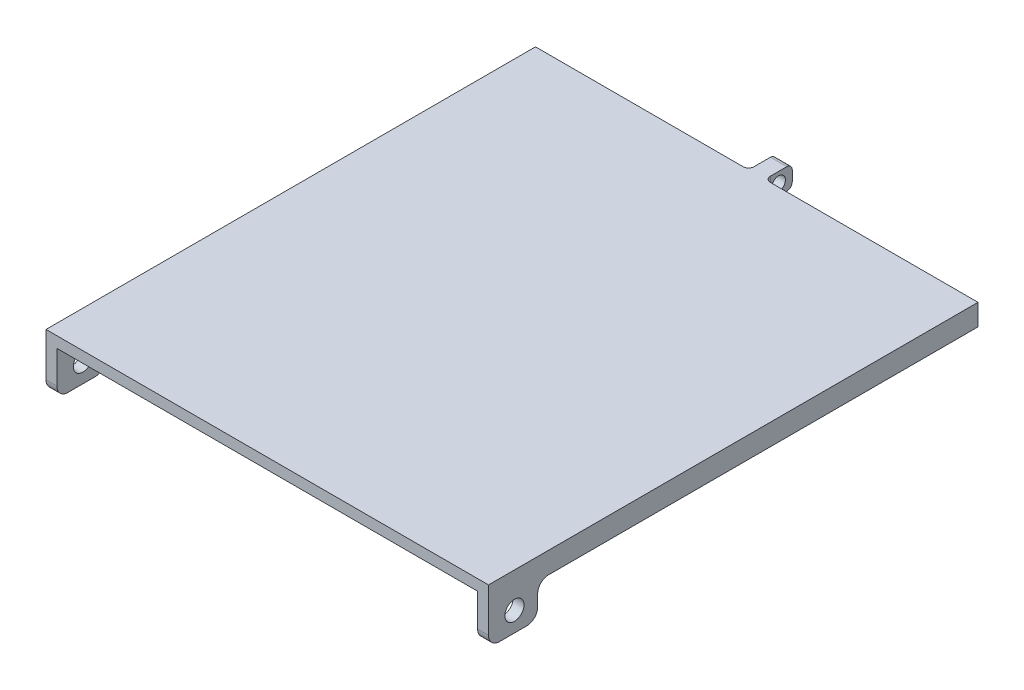
ISO-10303-21;
HEADER;
FILE_DESCRIPTION(('STEP AP214'),'2;1');
FILE_NAME('part.step','',(''),(''),'','','');
FILE_SCHEMA(('AUTOMOTIVE_DESIGN { 1 0 10303 214 1 1 1 1 }'));
ENDSEC;
DATA;
#1=APPLICATION_CONTEXT('core data for automotive mechanical design processes');
#2=APPLICATION_PROTOCOL_DEFINITION('international standard','automotive_design',2000,#1);
#3=PRODUCT_CONTEXT('',#1,'mechanical');
#4=PRODUCT('Part','Part','',(#3));
#5=PRODUCT_RELATED_PRODUCT_CATEGORY('part','',(#4));
#6=PRODUCT_DEFINITION_FORMATION('','',#4);
#7=PRODUCT_DEFINITION_CONTEXT('part definition',#1,'design');
#8=PRODUCT_DEFINITION('design','',#6,#7);
#9=PRODUCT_DEFINITION_SHAPE('','',#8);
#10=(LENGTH_UNIT() NAMED_UNIT(*) SI_UNIT(.MILLI.,.METRE.));
#11=(NAMED_UNIT(*) PLANE_ANGLE_UNIT() SI_UNIT($,.RADIAN.));
#12=(NAMED_UNIT(*) SI_UNIT($,.STERADIAN.) SOLID_ANGLE_UNIT());
#13=UNCERTAINTY_MEASURE_WITH_UNIT(LENGTH_MEASURE(1.E-05),#10,'distance_accuracy_value','');
#14=(GEOMETRIC_REPRESENTATION_CONTEXT(3) GLOBAL_UNCERTAINTY_ASSIGNED_CONTEXT((#13)) GLOBAL_UNIT_ASSIGNED_CONTEXT((#10,
#11,#12)) REPRESENTATION_CONTEXT('',''));
#15=CARTESIAN_POINT('',(0.,0.,0.));
#16=DIRECTION('',(0.,0.,1.));
#17=DIRECTION('',(1.,0.,0.));
#18=AXIS2_PLACEMENT_3D('',#15,#16,#17);
#19=CARTESIAN_POINT('',(32.8584578602391,8.,-94.0886048384759));
#20=DIRECTION('',(0.,0.,1.));
#21=DIRECTION('',(1.,0.,0.));
#22=AXIS2_PLACEMENT_3D('',#19,#20,#21);
#23=PLANE('',#22);
#24=DIRECTION('',(-1.,0.,0.));
#25=VECTOR('',#24,1.);
#26=CARTESIAN_POINT('',(-48.1415421397609,10.,-94.0886048384759));
#27=LINE('',#26,#25);
#28=CARTESIAN_POINT('',(-10.1415421397609,10.,-94.0886048384759));
#29=VERTEX_POINT('',#28);
#30=CARTESIAN_POINT('',(-48.1415421397609,10.,-94.0886048384759));
#31=VERTEX_POINT('',#30);
#32=EDGE_CURVE('E357',#29,#31,#27,.T.);
#33=ORIENTED_EDGE('',*,*,#32,.F.);
#34=DIRECTION('',(0.,1.,0.));
#35=VECTOR('',#34,1.);
#36=CARTESIAN_POINT('',(-10.1415421397609,8.,-94.0886048384759));
#37=LINE('',#36,#35);
#38=CARTESIAN_POINT('',(-10.1415421397609,6.1,-94.0886048384759));
#39=VERTEX_POINT('',#38);
#40=EDGE_CURVE('E54',#29,#39,#37,.F.);
#41=ORIENTED_EDGE('',*,*,#40,.T.);
#42=DIRECTION('',(-1.,0.,0.));
#43=VECTOR('',#42,1.);
#44=CARTESIAN_POINT('',(32.8584578602391,6.1,-94.0886048384759));
#45=LINE('',#44,#43);
#46=CARTESIAN_POINT('',(-48.1415421397609,6.1,-94.0886048384759));
#47=VERTEX_POINT('',#46);
#48=EDGE_CURVE('E318',#39,#47,#45,.T.);
#49=ORIENTED_EDGE('',*,*,#48,.T.);
#50=DIRECTION('',(0.,-1.,0.));
#51=VECTOR('',#50,1.);
#52=CARTESIAN_POINT('',(-48.1415421397609,8.,-94.0886048384759));
#53=LINE('',#52,#51);
#54=EDGE_CURVE('E405',#31,#47,#53,.T.);
#55=ORIENTED_EDGE('',*,*,#54,.F.);
#56=EDGE_LOOP('',(#33,#41,#49,#55));
#57=FACE_BOUND('',#56,.T.);
#58=ADVANCED_FACE('F33',(#57),#23,.F.);
#59=CARTESIAN_POINT('',(0.,8.,0.));
#60=DIRECTION('',(0.,1.,0.));
#61=DIRECTION('',(0.,0.,1.));
#62=AXIS2_PLACEMENT_3D('',#59,#60,#61);
#63=PLANE('',#62);
#64=DIRECTION('',(1.,0.,0.));
#65=VECTOR('',#64,1.);
#66=CARTESIAN_POINT('',(-48.1415421397609,8.,-4.48860483847592));
#67=LINE('',#66,#65);
#68=CARTESIAN_POINT('',(-46.1415421397609,8.,-4.48860483847592));
#69=VERTEX_POINT('',#68);
#70=CARTESIAN_POINT('',(30.8584578602391,8.,-4.48860483847592));
#71=VERTEX_POINT('',#70);
#72=EDGE_CURVE('E348',#69,#71,#67,.T.);
#73=ORIENTED_EDGE('',*,*,#72,.F.);
#74=DIRECTION('',(0.,0.,-1.));
#75=VECTOR('',#74,1.);
#76=CARTESIAN_POINT('',(-46.1415421397609,8.,-4.48860483847592));
#77=LINE('',#76,#75);
#78=CARTESIAN_POINT('',(-46.1415421397609,8.,-92.0886048384759));
#79=VERTEX_POINT('',#78);
#80=EDGE_CURVE('E364',#69,#79,#77,.T.);
#81=ORIENTED_EDGE('',*,*,#80,.T.);
#82=DIRECTION('',(1.,0.,0.));
#83=VECTOR('',#82,1.);
#84=CARTESIAN_POINT('',(-46.1415421397609,8.,-92.0886048384759));
#85=LINE('',#84,#83);
#86=CARTESIAN_POINT('',(30.8584578602391,8.,-92.0886048384759));
#87=VERTEX_POINT('',#86);
#88=EDGE_CURVE('E367',#79,#87,#85,.T.);
#89=ORIENTED_EDGE('',*,*,#88,.T.);
#90=DIRECTION('',(0.,0.,1.));
#91=VECTOR('',#90,1.);
#92=CARTESIAN_POINT('',(30.8584578602391,8.,-92.0886048384759));
#93=LINE('',#92,#91);
#94=EDGE_CURVE('E371',#87,#71,#93,.T.);
#95=ORIENTED_EDGE('',*,*,#94,.T.);
#96=EDGE_LOOP('',(#73,#81,#89,#95));
#97=FACE_BOUND('',#96,.T.);
#98=DIRECTION('',(0.,0.,-1.));
#99=VECTOR('',#98,1.);
#100=CARTESIAN_POINT('',(-42.0415421397609,8.,-13.005302831254));
#101=LINE('',#100,#99);
#102=CARTESIAN_POINT('',(-42.0415421397609,8.,-9.80530283125397));
#103=VERTEX_POINT('',#102);
#104=CARTESIAN_POINT('',(-42.0415421397609,8.,-13.005302831254));
#105=VERTEX_POINT('',#104);
#106=EDGE_CURVE('E297',#103,#105,#101,.T.);
#107=ORIENTED_EDGE('',*,*,#106,.F.);
#108=DIRECTION('',(-1.,0.,0.));
#109=VECTOR('',#108,1.);
#110=CARTESIAN_POINT('',(26.7584578602391,8.,-9.80530283125396));
#111=LINE('',#110,#109);
#112=CARTESIAN_POINT('',(26.7584578602391,8.,-9.80530283125396));
#113=VERTEX_POINT('',#112);
#114=EDGE_CURVE('E408',#103,#113,#111,.F.);
#115=ORIENTED_EDGE('',*,*,#114,.T.);
#116=DIRECTION('',(0.,0.,1.));
#117=VECTOR('',#116,1.);
#118=CARTESIAN_POINT('',(26.7584578602391,8.,-13.005302831254));
#119=LINE('',#118,#117);
#120=CARTESIAN_POINT('',(26.7584578602391,8.,-13.005302831254));
#121=VERTEX_POINT('',#120);
#122=EDGE_CURVE('E280',#121,#113,#119,.T.);
#123=ORIENTED_EDGE('',*,*,#122,.F.);
#124=DIRECTION('',(1.,0.,0.));
#125=VECTOR('',#124,1.);
#126=CARTESIAN_POINT('',(26.7584578602391,8.,-13.005302831254));
#127=LINE('',#126,#125);
#128=EDGE_CURVE('E288',#105,#121,#127,.T.);
#129=ORIENTED_EDGE('',*,*,#128,.F.);
#130=EDGE_LOOP('',(#107,#115,#123,#129));
#131=FACE_BOUND('',#130,.T.);
#132=ADVANCED_FACE('F511',(#97,#131),#63,.F.);
#133=CARTESIAN_POINT('',(0.,0.,0.));
#134=DIRECTION('',(0.,1.,0.));
#135=DIRECTION('',(0.,0.,1.));
#136=AXIS2_PLACEMENT_3D('',#133,#134,#135);
#137=PLANE('',#136);
#138=DIRECTION('',(0.,0.,-1.));
#139=VECTOR('',#138,1.);
#140=CARTESIAN_POINT('',(-46.1415421397609,0.,-13.4886048384759));
#141=LINE('',#140,#139);
#142=CARTESIAN_POINT('',(-46.1415421397609,0.,-6.48860483847592));
#143=VERTEX_POINT('',#142);
#144=CARTESIAN_POINT('',(-46.1415421397609,0.,-11.488604838476));
#145=VERTEX_POINT('',#144);
#146=EDGE_CURVE('E377',#143,#145,#141,.T.);
#147=ORIENTED_EDGE('',*,*,#146,.F.);
#148=DIRECTION('',(1.,0.,0.));
#149=VECTOR('',#148,1.);
#150=CARTESIAN_POINT('',(0.,0.,-6.48860483847592));
#151=LINE('',#150,#149);
#152=CARTESIAN_POINT('',(-48.1415421397609,0.,-6.48860483847592));
#153=VERTEX_POINT('',#152);
#154=EDGE_CURVE('E424',#143,#153,#151,.F.);
#155=ORIENTED_EDGE('',*,*,#154,.T.);
#156=DIRECTION('',(0.,0.,1.));
#157=VECTOR('',#156,1.);
#158=CARTESIAN_POINT('',(-48.1415421397609,0.,-94.0886048384759));
#159=LINE('',#158,#157);
#160=CARTESIAN_POINT('',(-48.1415421397609,0.,-11.488604838476));
#161=VERTEX_POINT('',#160);
#162=EDGE_CURVE('E361',#161,#153,#159,.T.);
#163=ORIENTED_EDGE('',*,*,#162,.F.);
#164=DIRECTION('',(1.,0.,0.));
#165=VECTOR('',#164,1.);
#166=CARTESIAN_POINT('',(0.,0.,-11.488604838476));
#167=LINE('',#166,#165);
#168=EDGE_CURVE('E421',#161,#145,#167,.T.);
#169=ORIENTED_EDGE('',*,*,#168,.T.);
#170=EDGE_LOOP('',(#147,#155,#163,#169));
#171=FACE_BOUND('',#170,.T.);
#172=ADVANCED_FACE('F516',(#171),#137,.F.);
#173=CARTESIAN_POINT('',(32.8584578602391,6.1,-94.0886048384759));
#174=VERTEX_POINT('',#173);
#175=CARTESIAN_POINT('',(-5.14154213976092,6.1,-94.0886048384759));
#176=VERTEX_POINT('',#175);
#177=EDGE_CURVE('E319',#174,#176,#45,.T.);
#178=ORIENTED_EDGE('',*,*,#177,.T.);
#179=DIRECTION('',(0.,1.,0.));
#180=VECTOR('',#179,1.);
#181=CARTESIAN_POINT('',(-5.14154213976092,10.,-94.0886048384759));
#182=LINE('',#181,#180);
#183=CARTESIAN_POINT('',(-5.14154213976092,10.,-94.0886048384759));
#184=VERTEX_POINT('',#183);
#185=EDGE_CURVE('E470',#176,#184,#182,.T.);
#186=ORIENTED_EDGE('',*,*,#185,.T.);
#187=CARTESIAN_POINT('',(32.8584578602391,10.,-94.0886048384759));
#188=VERTEX_POINT('',#187);
#189=EDGE_CURVE('E358',#188,#184,#27,.T.);
#190=ORIENTED_EDGE('',*,*,#189,.F.);
#191=DIRECTION('',(0.,-1.,0.));
#192=VECTOR('',#191,1.);
#193=CARTESIAN_POINT('',(32.8584578602391,8.,-94.0886048384759));
#194=LINE('',#193,#192);
#195=EDGE_CURVE('E374',#188,#174,#194,.T.);
#196=ORIENTED_EDGE('',*,*,#195,.T.);
#197=EDGE_LOOP('',(#178,#186,#190,#196));
#198=FACE_BOUND('',#197,.T.);
#199=ADVANCED_FACE('F491',(#198),#23,.F.);
#200=CARTESIAN_POINT('',(-48.1415421397609,8.,-94.0886048384759));
#201=DIRECTION('',(1.,0.,0.));
#202=DIRECTION('',(0.,0.,-1.));
#203=AXIS2_PLACEMENT_3D('',#200,#201,#202);
#204=PLANE('',#203);
#205=CARTESIAN_POINT('',(-48.1415421397609,3.6,-9.23860483847593));
#206=DIRECTION('',(1.,0.,0.));
#207=DIRECTION('',(0.,0.,-1.));
#208=AXIS2_PLACEMENT_3D('',#205,#206,#207);
#209=CIRCLE('',#208,1.75);
#210=CARTESIAN_POINT('',(-48.1415421397609,3.6,-10.9886048384759));
#211=VERTEX_POINT('',#210);
#212=EDGE_CURVE('E337',#211,#211,#209,.T.);
#213=ORIENTED_EDGE('',*,*,#212,.T.);
#214=EDGE_LOOP('',(#213));
#215=FACE_BOUND('',#214,.T.);
#216=ORIENTED_EDGE('',*,*,#162,.T.);
#217=CARTESIAN_POINT('',(-48.1415421397609,2.,-6.48860483847592));
#218=DIRECTION('',(1.,0.,0.));
#219=DIRECTION('',(0.,0.,-1.));
#220=AXIS2_PLACEMENT_3D('',#217,#218,#219);
#221=CIRCLE('',#220,2.);
#222=CARTESIAN_POINT('',(-48.1415421397609,2.,-4.48860483847592));
#223=VERTEX_POINT('',#222);
#224=EDGE_CURVE('E428',#153,#223,#221,.F.);
#225=ORIENTED_EDGE('',*,*,#224,.T.);
#226=DIRECTION('',(0.,-1.,0.));
#227=VECTOR('',#226,1.);
#228=CARTESIAN_POINT('',(-48.1415421397609,8.,-4.48860483847592));
#229=LINE('',#228,#227);
#230=CARTESIAN_POINT('',(-48.1415421397609,10.,-4.48860483847592));
#231=VERTEX_POINT('',#230);
#232=EDGE_CURVE('E402',#231,#223,#229,.T.);
#233=ORIENTED_EDGE('',*,*,#232,.F.);
#234=DIRECTION('',(0.,0.,1.));
#235=VECTOR('',#234,1.);
#236=CARTESIAN_POINT('',(-48.1415421397609,10.,-94.0886048384759));
#237=LINE('',#236,#235);
#238=EDGE_CURVE('E349',#31,#231,#237,.T.);
#239=ORIENTED_EDGE('',*,*,#238,.F.);
#240=ORIENTED_EDGE('',*,*,#54,.T.);
#241=DIRECTION('',(0.,0.,-1.));
#242=VECTOR('',#241,1.);
#243=CARTESIAN_POINT('',(-48.1415421397609,6.1,-94.0886048384759));
#244=LINE('',#243,#242);
#245=CARTESIAN_POINT('',(-48.1415421397609,6.1,-15.488604838476));
#246=VERTEX_POINT('',#245);
#247=EDGE_CURVE('E310',#246,#47,#244,.T.);
#248=ORIENTED_EDGE('',*,*,#247,.F.);
#249=CARTESIAN_POINT('',(-48.1415421397609,4.1,-15.488604838476));
#250=DIRECTION('',(1.,0.,0.));
#251=DIRECTION('',(0.,0.,-1.));
#252=AXIS2_PLACEMENT_3D('',#249,#250,#251);
#253=CIRCLE('',#252,2.);
#254=CARTESIAN_POINT('',(-48.1415421397609,4.1,-13.488604838476));
#255=VERTEX_POINT('',#254);
#256=EDGE_CURVE('E462',#246,#255,#253,.T.);
#257=ORIENTED_EDGE('',*,*,#256,.T.);
#258=DIRECTION('',(0.,1.,0.));
#259=VECTOR('',#258,1.);
#260=CARTESIAN_POINT('',(-48.1415421397609,6.1,-13.488604838476));
#261=LINE('',#260,#259);
#262=CARTESIAN_POINT('',(-48.1415421397609,2.,-13.488604838476));
#263=VERTEX_POINT('',#262);
#264=EDGE_CURVE('E307',#263,#255,#261,.T.);
#265=ORIENTED_EDGE('',*,*,#264,.F.);
#266=CARTESIAN_POINT('',(-48.1415421397609,2.,-11.488604838476));
#267=DIRECTION('',(1.,0.,0.));
#268=DIRECTION('',(0.,0.,-1.));
#269=AXIS2_PLACEMENT_3D('',#266,#267,#268);
#270=CIRCLE('',#269,2.);
#271=EDGE_CURVE('E426',#263,#161,#270,.F.);
#272=ORIENTED_EDGE('',*,*,#271,.T.);
#273=EDGE_LOOP('',(#216,#225,#233,#239,#240,#248,#257,#265,#272));
#274=FACE_BOUND('',#273,.T.);
#275=ADVANCED_FACE('F522',(#215,#274),#204,.F.);
#276=CARTESIAN_POINT('',(-46.1415421397609,8.,-13.4886048384759));
#277=DIRECTION('',(-1.,0.,0.));
#278=DIRECTION('',(0.,0.,1.));
#279=AXIS2_PLACEMENT_3D('',#276,#277,#278);
#280=PLANE('',#279);
#281=CARTESIAN_POINT('',(-46.1415421397609,3.6,-9.23860483847593));
#282=DIRECTION('',(-1.,0.,0.));
#283=DIRECTION('',(0.,0.,1.));
#284=AXIS2_PLACEMENT_3D('',#281,#282,#283);
#285=CIRCLE('',#284,1.75);
#286=CARTESIAN_POINT('',(-46.1415421397609,3.6,-7.48860483847593));
#287=VERTEX_POINT('',#286);
#288=EDGE_CURVE('E345',#287,#287,#285,.T.);
#289=ORIENTED_EDGE('',*,*,#288,.T.);
#290=EDGE_LOOP('',(#289));
#291=FACE_BOUND('',#290,.T.);
#292=DIRECTION('',(0.,-1.,0.));
#293=VECTOR('',#292,1.);
#294=CARTESIAN_POINT('',(-46.1415421397609,8.,-4.48860483847592));
#295=LINE('',#294,#293);
#296=CARTESIAN_POINT('',(-46.1415421397609,2.,-4.48860483847592));
#297=VERTEX_POINT('',#296);
#298=EDGE_CURVE('E399',#69,#297,#295,.T.);
#299=ORIENTED_EDGE('',*,*,#298,.T.);
#300=CARTESIAN_POINT('',(-46.1415421397609,2.,-6.48860483847592));
#301=DIRECTION('',(-1.,0.,0.));
#302=DIRECTION('',(0.,0.,1.));
#303=AXIS2_PLACEMENT_3D('',#300,#301,#302);
#304=CIRCLE('',#303,2.);
#305=EDGE_CURVE('E419',#297,#143,#304,.F.);
#306=ORIENTED_EDGE('',*,*,#305,.T.);
#307=ORIENTED_EDGE('',*,*,#146,.T.);
#308=CARTESIAN_POINT('',(-46.1415421397609,2.,-11.488604838476));
#309=DIRECTION('',(-1.,0.,0.));
#310=DIRECTION('',(0.,0.,1.));
#311=AXIS2_PLACEMENT_3D('',#308,#309,#310);
#312=CIRCLE('',#311,2.);
#313=CARTESIAN_POINT('',(-46.1415421397609,2.,-13.488604838476));
#314=VERTEX_POINT('',#313);
#315=EDGE_CURVE('E417',#145,#314,#312,.F.);
#316=ORIENTED_EDGE('',*,*,#315,.T.);
#317=DIRECTION('',(0.,1.,0.));
#318=VECTOR('',#317,1.);
#319=CARTESIAN_POINT('',(-46.1415421397609,8.,-13.488604838476));
#320=LINE('',#319,#318);
#321=CARTESIAN_POINT('',(-46.1415421397609,4.1,-13.488604838476));
#322=VERTEX_POINT('',#321);
#323=EDGE_CURVE('E325',#314,#322,#320,.T.);
#324=ORIENTED_EDGE('',*,*,#323,.T.);
#325=CARTESIAN_POINT('',(-46.1415421397609,4.1,-15.488604838476));
#326=DIRECTION('',(-1.,0.,0.));
#327=DIRECTION('',(0.,0.,1.));
#328=AXIS2_PLACEMENT_3D('',#325,#326,#327);
#329=CIRCLE('',#328,2.);
#330=CARTESIAN_POINT('',(-46.1415421397609,6.1,-15.488604838476));
#331=VERTEX_POINT('',#330);
#332=EDGE_CURVE('E464',#322,#331,#329,.T.);
#333=ORIENTED_EDGE('',*,*,#332,.T.);
#334=DIRECTION('',(0.,0.,-1.));
#335=VECTOR('',#334,1.);
#336=CARTESIAN_POINT('',(-46.1415421397609,6.1,-13.4886048384759));
#337=LINE('',#336,#335);
#338=CARTESIAN_POINT('',(-46.1415421397609,6.1,-92.0886048384759));
#339=VERTEX_POINT('',#338);
#340=EDGE_CURVE('E334',#331,#339,#337,.T.);
#341=ORIENTED_EDGE('',*,*,#340,.T.);
#342=DIRECTION('',(0.,-1.,0.));
#343=VECTOR('',#342,1.);
#344=CARTESIAN_POINT('',(-46.1415421397609,8.,-92.0886048384759));
#345=LINE('',#344,#343);
#346=EDGE_CURVE('E396',#79,#339,#345,.T.);
#347=ORIENTED_EDGE('',*,*,#346,.F.);
#348=ORIENTED_EDGE('',*,*,#80,.F.);
#349=EDGE_LOOP('',(#299,#306,#307,#316,#324,#333,#341,#347,#348));
#350=FACE_BOUND('',#349,.T.);
#351=ADVANCED_FACE('F527',(#291,#350),#280,.F.);
#352=CARTESIAN_POINT('',(-46.1415421397609,8.,-92.0886048384759));
#353=DIRECTION('',(0.,0.,-1.));
#354=DIRECTION('',(-1.,0.,0.));
#355=AXIS2_PLACEMENT_3D('',#352,#353,#354);
#356=PLANE('',#355);
#357=ORIENTED_EDGE('',*,*,#346,.T.);
#358=DIRECTION('',(1.,0.,0.));
#359=VECTOR('',#358,1.);
#360=CARTESIAN_POINT('',(-46.1415421397609,6.1,-92.0886048384759));
#361=LINE('',#360,#359);
#362=CARTESIAN_POINT('',(30.858457860239,6.1,-92.0886048384759));
#363=VERTEX_POINT('',#362);
#364=EDGE_CURVE('E331',#339,#363,#361,.T.);
#365=ORIENTED_EDGE('',*,*,#364,.T.);
#366=DIRECTION('',(0.,-1.,0.));
#367=VECTOR('',#366,1.);
#368=CARTESIAN_POINT('',(30.8584578602391,8.,-92.0886048384759));
#369=LINE('',#368,#367);
#370=EDGE_CURVE('E393',#87,#363,#369,.T.);
#371=ORIENTED_EDGE('',*,*,#370,.F.);
#372=ORIENTED_EDGE('',*,*,#88,.F.);
#373=EDGE_LOOP('',(#357,#365,#371,#372));
#374=FACE_BOUND('',#373,.T.);
#375=ADVANCED_FACE('F566',(#374),#356,.F.);
#376=CARTESIAN_POINT('',(30.8584578602391,8.,-13.4886048384759));
#377=DIRECTION('',(1.,0.,0.));
#378=DIRECTION('',(0.,0.,-1.));
#379=AXIS2_PLACEMENT_3D('',#376,#377,#378);
#380=PLANE('',#379);
#381=CARTESIAN_POINT('',(30.8584578602391,3.6,-9.23860483847592));
#382=DIRECTION('',(1.,0.,0.));
#383=DIRECTION('',(0.,0.,-1.));
#384=AXIS2_PLACEMENT_3D('',#381,#382,#383);
#385=CIRCLE('',#384,1.75);
#386=CARTESIAN_POINT('',(30.8584578602391,3.6,-10.9886048384759));
#387=VERTEX_POINT('',#386);
#388=EDGE_CURVE('E340',#387,#387,#385,.T.);
#389=ORIENTED_EDGE('',*,*,#388,.T.);
#390=EDGE_LOOP('',(#389));
#391=FACE_BOUND('',#390,.T.);
#392=DIRECTION('',(0.,0.,1.));
#393=VECTOR('',#392,1.);
#394=CARTESIAN_POINT('',(30.8584578602391,0.,-13.4886048384759));
#395=LINE('',#394,#393);
#396=CARTESIAN_POINT('',(30.8584578602391,0.,-11.488604838476));
#397=VERTEX_POINT('',#396);
#398=CARTESIAN_POINT('',(30.8584578602391,0.,-6.48860483847592));
#399=VERTEX_POINT('',#398);
#400=EDGE_CURVE('E380',#397,#399,#395,.T.);
#401=ORIENTED_EDGE('',*,*,#400,.T.);
#402=CARTESIAN_POINT('',(30.8584578602391,2.,-6.48860483847592));
#403=DIRECTION('',(1.,0.,0.));
#404=DIRECTION('',(0.,0.,-1.));
#405=AXIS2_PLACEMENT_3D('',#402,#403,#404);
#406=CIRCLE('',#405,2.);
#407=CARTESIAN_POINT('',(30.8584578602391,2.,-4.48860483847592));
#408=VERTEX_POINT('',#407);
#409=EDGE_CURVE('E455',#399,#408,#406,.F.);
#410=ORIENTED_EDGE('',*,*,#409,.T.);
#411=DIRECTION('',(0.,-1.,0.));
#412=VECTOR('',#411,1.);
#413=CARTESIAN_POINT('',(30.8584578602391,8.,-4.48860483847592));
#414=LINE('',#413,#412);
#415=EDGE_CURVE('E390',#71,#408,#414,.T.);
#416=ORIENTED_EDGE('',*,*,#415,.F.);
#417=ORIENTED_EDGE('',*,*,#94,.F.);
#418=ORIENTED_EDGE('',*,*,#370,.T.);
#419=DIRECTION('',(0.,0.,1.));
#420=VECTOR('',#419,1.);
#421=CARTESIAN_POINT('',(30.8584578602391,6.1,-13.4886048384759));
#422=LINE('',#421,#420);
#423=CARTESIAN_POINT('',(30.8584578602391,6.1,-15.488604838476));
#424=VERTEX_POINT('',#423);
#425=EDGE_CURVE('E328',#363,#424,#422,.T.);
#426=ORIENTED_EDGE('',*,*,#425,.T.);
#427=CARTESIAN_POINT('',(30.8584578602391,4.1,-15.488604838476));
#428=DIRECTION('',(1.,0.,0.));
#429=DIRECTION('',(0.,0.,-1.));
#430=AXIS2_PLACEMENT_3D('',#427,#428,#429);
#431=CIRCLE('',#430,2.);
#432=CARTESIAN_POINT('',(30.8584578602391,4.1,-13.488604838476));
#433=VERTEX_POINT('',#432);
#434=EDGE_CURVE('E466',#424,#433,#431,.T.);
#435=ORIENTED_EDGE('',*,*,#434,.T.);
#436=DIRECTION('',(0.,-1.,0.));
#437=VECTOR('',#436,1.);
#438=CARTESIAN_POINT('',(30.8584578602391,8.,-13.488604838476));
#439=LINE('',#438,#437);
#440=CARTESIAN_POINT('',(30.8584578602391,2.,-13.488604838476));
#441=VERTEX_POINT('',#440);
#442=EDGE_CURVE('E322',#433,#441,#439,.T.);
#443=ORIENTED_EDGE('',*,*,#442,.T.);
#444=CARTESIAN_POINT('',(30.8584578602391,2.,-11.488604838476));
#445=DIRECTION('',(1.,0.,0.));
#446=DIRECTION('',(0.,0.,-1.));
#447=AXIS2_PLACEMENT_3D('',#444,#445,#446);
#448=CIRCLE('',#447,2.);
#449=EDGE_CURVE('E453',#441,#397,#448,.F.);
#450=ORIENTED_EDGE('',*,*,#449,.T.);
#451=EDGE_LOOP('',(#401,#410,#416,#417,#418,#426,#435,#443,#450));
#452=FACE_BOUND('',#451,.T.);
#453=ADVANCED_FACE('F558',(#391,#452),#380,.F.);
#454=CARTESIAN_POINT('',(30.8584578602391,8.,-4.48860483847592));
#455=DIRECTION('',(0.,0.,-1.));
#456=DIRECTION('',(-1.,0.,0.));
#457=AXIS2_PLACEMENT_3D('',#454,#455,#456);
#458=PLANE('',#457);
#459=ORIENTED_EDGE('',*,*,#232,.T.);
#460=DIRECTION('',(1.,0.,0.));
#461=VECTOR('',#460,1.);
#462=CARTESIAN_POINT('',(30.8584578602391,2.,-4.48860483847592));
#463=LINE('',#462,#461);
#464=EDGE_CURVE('E414',#223,#297,#463,.T.);
#465=ORIENTED_EDGE('',*,*,#464,.T.);
#466=ORIENTED_EDGE('',*,*,#298,.F.);
#467=ORIENTED_EDGE('',*,*,#72,.T.);
#468=ORIENTED_EDGE('',*,*,#415,.T.);
#469=DIRECTION('',(1.,0.,0.));
#470=VECTOR('',#469,1.);
#471=CARTESIAN_POINT('',(30.8584578602391,2.,-4.48860483847592));
#472=LINE('',#471,#470);
#473=CARTESIAN_POINT('',(32.8584578602391,2.,-4.48860483847592));
#474=VERTEX_POINT('',#473);
#475=EDGE_CURVE('E411',#408,#474,#472,.T.);
#476=ORIENTED_EDGE('',*,*,#475,.T.);
#477=DIRECTION('',(0.,-1.,0.));
#478=VECTOR('',#477,1.);
#479=CARTESIAN_POINT('',(32.8584578602391,8.,-4.48860483847592));
#480=LINE('',#479,#478);
#481=CARTESIAN_POINT('',(32.8584578602391,10.,-4.48860483847592));
#482=VERTEX_POINT('',#481);
#483=EDGE_CURVE('E387',#482,#474,#480,.T.);
#484=ORIENTED_EDGE('',*,*,#483,.F.);
#485=DIRECTION('',(1.,0.,0.));
#486=VECTOR('',#485,1.);
#487=CARTESIAN_POINT('',(-48.1415421397609,10.,-4.48860483847592));
#488=LINE('',#487,#486);
#489=EDGE_CURVE('E351',#231,#482,#488,.T.);
#490=ORIENTED_EDGE('',*,*,#489,.F.);
#491=EDGE_LOOP('',(#459,#465,#466,#467,#468,#476,#484,#490));
#492=FACE_BOUND('',#491,.T.);
#493=ADVANCED_FACE('F545',(#492),#458,.F.);
#494=CARTESIAN_POINT('',(32.8584578602391,8.,-4.48860483847592));
#495=DIRECTION('',(-1.,0.,0.));
#496=DIRECTION('',(0.,0.,1.));
#497=AXIS2_PLACEMENT_3D('',#494,#495,#496);
#498=PLANE('',#497);
#499=CARTESIAN_POINT('',(32.8584578602391,3.6,-9.23860483847592));
#500=DIRECTION('',(1.,0.,0.));
#501=DIRECTION('',(0.,0.,-1.));
#502=AXIS2_PLACEMENT_3D('',#499,#500,#501);
#503=CIRCLE('',#502,1.75);
#504=CARTESIAN_POINT('',(32.8584578602391,3.6,-10.9886048384759));
#505=VERTEX_POINT('',#504);
#506=EDGE_CURVE('E336',#505,#505,#503,.T.);
#507=ORIENTED_EDGE('',*,*,#506,.F.);
#508=EDGE_LOOP('',(#507));
#509=FACE_BOUND('',#508,.T.);
#510=ORIENTED_EDGE('',*,*,#483,.T.);
#511=CARTESIAN_POINT('',(32.8584578602391,2.,-6.48860483847592));
#512=DIRECTION('',(-1.,0.,0.));
#513=DIRECTION('',(0.,0.,1.));
#514=AXIS2_PLACEMENT_3D('',#511,#512,#513);
#515=CIRCLE('',#514,2.);
#516=CARTESIAN_POINT('',(32.8584578602391,0.,-6.48860483847592));
#517=VERTEX_POINT('',#516);
#518=EDGE_CURVE('E447',#474,#517,#515,.F.);
#519=ORIENTED_EDGE('',*,*,#518,.T.);
#520=DIRECTION('',(0.,0.,-1.));
#521=VECTOR('',#520,1.);
#522=CARTESIAN_POINT('',(32.8584578602391,0.,-4.48860483847592));
#523=LINE('',#522,#521);
#524=CARTESIAN_POINT('',(32.8584578602391,0.,-11.488604838476));
#525=VERTEX_POINT('',#524);
#526=EDGE_CURVE('E368',#517,#525,#523,.T.);
#527=ORIENTED_EDGE('',*,*,#526,.T.);
#528=CARTESIAN_POINT('',(32.8584578602391,2.,-11.488604838476));
#529=DIRECTION('',(-1.,0.,0.));
#530=DIRECTION('',(0.,0.,1.));
#531=AXIS2_PLACEMENT_3D('',#528,#529,#530);
#532=CIRCLE('',#531,2.);
#533=CARTESIAN_POINT('',(32.8584578602391,2.,-13.488604838476));
#534=VERTEX_POINT('',#533);
#535=EDGE_CURVE('E445',#525,#534,#532,.F.);
#536=ORIENTED_EDGE('',*,*,#535,.T.);
#537=DIRECTION('',(0.,1.,0.));
#538=VECTOR('',#537,1.);
#539=CARTESIAN_POINT('',(32.8584578602391,6.1,-13.488604838476));
#540=LINE('',#539,#538);
#541=CARTESIAN_POINT('',(32.8584578602391,4.1,-13.488604838476));
#542=VERTEX_POINT('',#541);
#543=EDGE_CURVE('E313',#534,#542,#540,.T.);
#544=ORIENTED_EDGE('',*,*,#543,.T.);
#545=CARTESIAN_POINT('',(32.8584578602391,4.1,-15.488604838476));
#546=DIRECTION('',(-1.,0.,0.));
#547=DIRECTION('',(0.,0.,1.));
#548=AXIS2_PLACEMENT_3D('',#545,#546,#547);
#549=CIRCLE('',#548,2.);
#550=CARTESIAN_POINT('',(32.8584578602391,6.1,-15.488604838476));
#551=VERTEX_POINT('',#550);
#552=EDGE_CURVE('E468',#542,#551,#549,.T.);
#553=ORIENTED_EDGE('',*,*,#552,.T.);
#554=DIRECTION('',(0.,0.,-1.));
#555=VECTOR('',#554,1.);
#556=CARTESIAN_POINT('',(32.8584578602391,6.1,-94.0886048384759));
#557=LINE('',#556,#555);
#558=EDGE_CURVE('E316',#551,#174,#557,.T.);
#559=ORIENTED_EDGE('',*,*,#558,.T.);
#560=ORIENTED_EDGE('',*,*,#195,.F.);
#561=DIRECTION('',(0.,0.,-1.));
#562=VECTOR('',#561,1.);
#563=CARTESIAN_POINT('',(32.8584578602391,10.,-94.0886048384759));
#564=LINE('',#563,#562);
#565=EDGE_CURVE('E354',#482,#188,#564,.T.);
#566=ORIENTED_EDGE('',*,*,#565,.F.);
#567=EDGE_LOOP('',(#510,#519,#527,#536,#544,#553,#559,#560,#566));
#568=FACE_BOUND('',#567,.T.);
#569=ADVANCED_FACE('F537',(#509,#568),#498,.F.);
#570=ORIENTED_EDGE('',*,*,#526,.F.);
#571=DIRECTION('',(1.,0.,0.));
#572=VECTOR('',#571,1.);
#573=CARTESIAN_POINT('',(0.,0.,-6.48860483847592));
#574=LINE('',#573,#572);
#575=EDGE_CURVE('E451',#517,#399,#574,.F.);
#576=ORIENTED_EDGE('',*,*,#575,.T.);
#577=ORIENTED_EDGE('',*,*,#400,.F.);
#578=DIRECTION('',(-1.,0.,0.));
#579=VECTOR('',#578,1.);
#580=CARTESIAN_POINT('',(0.,0.,-11.488604838476));
#581=LINE('',#580,#579);
#582=EDGE_CURVE('E449',#397,#525,#581,.F.);
#583=ORIENTED_EDGE('',*,*,#582,.T.);
#584=EDGE_LOOP('',(#570,#576,#577,#583));
#585=FACE_BOUND('',#584,.T.);
#586=ADVANCED_FACE('F531',(#585),#137,.F.);
#587=CARTESIAN_POINT('',(0.,10.,0.));
#588=DIRECTION('',(0.,1.,0.));
#589=DIRECTION('',(0.,0.,1.));
#590=AXIS2_PLACEMENT_3D('',#587,#588,#589);
#591=PLANE('',#590);
#592=ORIENTED_EDGE('',*,*,#238,.T.);
#593=ORIENTED_EDGE('',*,*,#489,.T.);
#594=ORIENTED_EDGE('',*,*,#565,.T.);
#595=ORIENTED_EDGE('',*,*,#189,.T.);
#596=CARTESIAN_POINT('',(-5.14154213976092,10.,-95.0886048384759));
#597=DIRECTION('',(0.,1.,0.));
#598=DIRECTION('',(0.,0.,1.));
#599=AXIS2_PLACEMENT_3D('',#596,#597,#598);
#600=CIRCLE('',#599,1.);
#601=CARTESIAN_POINT('',(-6.14154213976092,10.,-95.0886048384759));
#602=VERTEX_POINT('',#601);
#603=EDGE_CURVE('E477',#184,#602,#600,.F.);
#604=ORIENTED_EDGE('',*,*,#603,.T.);
#605=DIRECTION('',(0.,0.,-1.));
#606=VECTOR('',#605,1.);
#607=CARTESIAN_POINT('',(-6.14154213976092,10.,-94.0886048384759));
#608=LINE('',#607,#606);
#609=CARTESIAN_POINT('',(-6.14154213976092,10.,-98.0886048384759));
#610=VERTEX_POINT('',#609);
#611=EDGE_CURVE('E246',#602,#610,#608,.T.);
#612=ORIENTED_EDGE('',*,*,#611,.T.);
#613=DIRECTION('',(-1.,0.,0.));
#614=VECTOR('',#613,1.);
#615=CARTESIAN_POINT('',(-6.14154213976092,10.,-98.0886048384759));
#616=LINE('',#615,#614);
#617=CARTESIAN_POINT('',(-9.14154213976092,10.,-98.0886048384759));
#618=VERTEX_POINT('',#617);
#619=EDGE_CURVE('E242',#610,#618,#616,.T.);
#620=ORIENTED_EDGE('',*,*,#619,.T.);
#621=DIRECTION('',(0.,0.,-1.));
#622=VECTOR('',#621,1.);
#623=CARTESIAN_POINT('',(-9.14154213976092,10.,-94.0886048384759));
#624=LINE('',#623,#622);
#625=CARTESIAN_POINT('',(-9.14154213976092,10.,-95.0886048384759));
#626=VERTEX_POINT('',#625);
#627=EDGE_CURVE('E228',#626,#618,#624,.T.);
#628=ORIENTED_EDGE('',*,*,#627,.F.);
#629=CARTESIAN_POINT('',(-10.1415421397609,10.,-95.0886048384759));
#630=DIRECTION('',(0.,1.,0.));
#631=DIRECTION('',(0.,0.,1.));
#632=AXIS2_PLACEMENT_3D('',#629,#630,#631);
#633=CIRCLE('',#632,1.);
#634=EDGE_CURVE('E41',#626,#29,#633,.F.);
#635=ORIENTED_EDGE('',*,*,#634,.T.);
#636=ORIENTED_EDGE('',*,*,#32,.T.);
#637=EDGE_LOOP('',(#592,#593,#594,#595,#604,#612,#620,#628,#635,#636));
#638=FACE_BOUND('',#637,.T.);
#639=ADVANCED_FACE('F244',(#638),#591,.T.);
#640=CARTESIAN_POINT('',(-48.1415421397609,3.6,-9.23860483847593));
#641=DIRECTION('',(1.,0.,0.));
#642=DIRECTION('',(0.,0.,-1.));
#643=AXIS2_PLACEMENT_3D('',#640,#641,#642);
#644=CYLINDRICAL_SURFACE('',#643,1.75);
#645=ORIENTED_EDGE('',*,*,#506,.T.);
#646=EDGE_LOOP('',(#645));
#647=FACE_BOUND('',#646,.T.);
#648=ORIENTED_EDGE('',*,*,#388,.F.);
#649=EDGE_LOOP('',(#648));
#650=FACE_BOUND('',#649,.T.);
#651=ADVANCED_FACE('F543',(#647,#650),#644,.F.);
#652=ORIENTED_EDGE('',*,*,#212,.F.);
#653=EDGE_LOOP('',(#652));
#654=FACE_BOUND('',#653,.T.);
#655=ORIENTED_EDGE('',*,*,#288,.F.);
#656=EDGE_LOOP('',(#655));
#657=FACE_BOUND('',#656,.T.);
#658=ADVANCED_FACE('F652',(#654,#657),#644,.F.);
#659=CARTESIAN_POINT('',(32.8584578602391,6.1,-94.0886048384759));
#660=DIRECTION('',(0.,1.,0.));
#661=DIRECTION('',(0.,0.,1.));
#662=AXIS2_PLACEMENT_3D('',#659,#660,#661);
#663=PLANE('',#662);
#664=ORIENTED_EDGE('',*,*,#340,.F.);
#665=DIRECTION('',(-1.,0.,0.));
#666=VECTOR('',#665,1.);
#667=CARTESIAN_POINT('',(-48.1415421397609,6.1,-15.488604838476));
#668=LINE('',#667,#666);
#669=EDGE_CURVE('E437',#331,#246,#668,.T.);
#670=ORIENTED_EDGE('',*,*,#669,.T.);
#671=ORIENTED_EDGE('',*,*,#247,.T.);
#672=ORIENTED_EDGE('',*,*,#48,.F.);
#673=CARTESIAN_POINT('',(-10.1415421397609,6.1,-95.0886048384759));
#674=DIRECTION('',(0.,1.,0.));
#675=DIRECTION('',(0.,0.,1.));
#676=AXIS2_PLACEMENT_3D('',#673,#674,#675);
#677=CIRCLE('',#676,1.);
#678=CARTESIAN_POINT('',(-9.14154213976092,6.1,-95.0886048384759));
#679=VERTEX_POINT('',#678);
#680=EDGE_CURVE('E11',#39,#679,#677,.T.);
#681=ORIENTED_EDGE('',*,*,#680,.T.);
#682=DIRECTION('',(0.,0.,1.));
#683=VECTOR('',#682,1.);
#684=CARTESIAN_POINT('',(-9.14154213976092,6.1,-94.0886048384759));
#685=LINE('',#684,#683);
#686=CARTESIAN_POINT('',(-9.14154213976092,6.1,-98.0886048384759));
#687=VERTEX_POINT('',#686);
#688=EDGE_CURVE('E262',#687,#679,#685,.T.);
#689=ORIENTED_EDGE('',*,*,#688,.F.);
#690=DIRECTION('',(-1.,0.,0.));
#691=VECTOR('',#690,1.);
#692=CARTESIAN_POINT('',(-6.14154213976092,6.1,-98.0886048384759));
#693=LINE('',#692,#691);
#694=CARTESIAN_POINT('',(-6.14154213976092,6.1,-98.0886048384759));
#695=VERTEX_POINT('',#694);
#696=EDGE_CURVE('E278',#695,#687,#693,.T.);
#697=ORIENTED_EDGE('',*,*,#696,.F.);
#698=DIRECTION('',(0.,0.,1.));
#699=VECTOR('',#698,1.);
#700=CARTESIAN_POINT('',(-6.14154213976092,6.1,-94.0886048384759));
#701=LINE('',#700,#699);
#702=CARTESIAN_POINT('',(-6.14154213976092,6.1,-95.0886048384759));
#703=VERTEX_POINT('',#702);
#704=EDGE_CURVE('E251',#695,#703,#701,.T.);
#705=ORIENTED_EDGE('',*,*,#704,.T.);
#706=CARTESIAN_POINT('',(-5.14154213976092,6.1,-95.0886048384759));
#707=DIRECTION('',(0.,1.,0.));
#708=DIRECTION('',(0.,0.,1.));
#709=AXIS2_PLACEMENT_3D('',#706,#707,#708);
#710=CIRCLE('',#709,1.);
#711=EDGE_CURVE('E479',#703,#176,#710,.T.);
#712=ORIENTED_EDGE('',*,*,#711,.T.);
#713=ORIENTED_EDGE('',*,*,#177,.F.);
#714=ORIENTED_EDGE('',*,*,#558,.F.);
#715=DIRECTION('',(-1.,0.,0.));
#716=VECTOR('',#715,1.);
#717=CARTESIAN_POINT('',(30.8584578602391,6.1,-15.488604838476));
#718=LINE('',#717,#716);
#719=EDGE_CURVE('E434',#551,#424,#718,.T.);
#720=ORIENTED_EDGE('',*,*,#719,.T.);
#721=ORIENTED_EDGE('',*,*,#425,.F.);
#722=ORIENTED_EDGE('',*,*,#364,.F.);
#723=EDGE_LOOP('',(#664,#670,#671,#672,#681,#689,#697,#705,#712,#713,#714,#720,#721,#722));
#724=FACE_BOUND('',#723,.T.);
#725=ADVANCED_FACE('F484',(#724),#663,.F.);
#726=CARTESIAN_POINT('',(32.8584578602391,6.1,-13.488604838476));
#727=DIRECTION('',(0.,0.,1.));
#728=DIRECTION('',(1.,0.,0.));
#729=AXIS2_PLACEMENT_3D('',#726,#727,#728);
#730=PLANE('',#729);
#731=ORIENTED_EDGE('',*,*,#323,.F.);
#732=DIRECTION('',(1.,0.,0.));
#733=VECTOR('',#732,1.);
#734=CARTESIAN_POINT('',(32.8584578602391,2.,-13.488604838476));
#735=LINE('',#734,#733);
#736=EDGE_CURVE('E432',#314,#263,#735,.F.);
#737=ORIENTED_EDGE('',*,*,#736,.T.);
#738=ORIENTED_EDGE('',*,*,#264,.T.);
#739=DIRECTION('',(-1.,0.,0.));
#740=VECTOR('',#739,1.);
#741=CARTESIAN_POINT('',(-46.1415421397609,4.1,-13.488604838476));
#742=LINE('',#741,#740);
#743=EDGE_CURVE('E430',#255,#322,#742,.F.);
#744=ORIENTED_EDGE('',*,*,#743,.T.);
#745=EDGE_LOOP('',(#731,#737,#738,#744));
#746=FACE_BOUND('',#745,.T.);
#747=ADVANCED_FACE('F600',(#746),#730,.F.);
#748=ORIENTED_EDGE('',*,*,#442,.F.);
#749=DIRECTION('',(-1.,0.,0.));
#750=VECTOR('',#749,1.);
#751=CARTESIAN_POINT('',(32.8584578602391,4.1,-13.488604838476));
#752=LINE('',#751,#750);
#753=EDGE_CURVE('E443',#433,#542,#752,.F.);
#754=ORIENTED_EDGE('',*,*,#753,.T.);
#755=ORIENTED_EDGE('',*,*,#543,.F.);
#756=DIRECTION('',(-1.,0.,0.));
#757=VECTOR('',#756,1.);
#758=CARTESIAN_POINT('',(32.8584578602391,2.,-13.488604838476));
#759=LINE('',#758,#757);
#760=EDGE_CURVE('E440',#534,#441,#759,.T.);
#761=ORIENTED_EDGE('',*,*,#760,.T.);
#762=EDGE_LOOP('',(#748,#754,#755,#761));
#763=FACE_BOUND('',#762,.T.);
#764=ADVANCED_FACE('F576',(#763),#730,.F.);
#765=CARTESIAN_POINT('',(26.7584578602391,6.,-13.005302831254));
#766=DIRECTION('',(-1.,0.,0.));
#767=DIRECTION('',(0.,-1.,0.));
#768=AXIS2_PLACEMENT_3D('',#765,#766,#767);
#769=PLANE('',#768);
#770=ORIENTED_EDGE('',*,*,#122,.T.);
#771=CARTESIAN_POINT('',(26.7584578602391,6.,-9.80530283125396));
#772=DIRECTION('',(-1.,0.,0.));
#773=DIRECTION('',(0.,-1.,0.));
#774=AXIS2_PLACEMENT_3D('',#771,#772,#773);
#775=CIRCLE('',#774,2.);
#776=CARTESIAN_POINT('',(26.7584578602391,6.,-11.805302831254));
#777=VERTEX_POINT('',#776);
#778=EDGE_CURVE('E460',#113,#777,#775,.T.);
#779=ORIENTED_EDGE('',*,*,#778,.T.);
#780=DIRECTION('',(0.,0.,1.));
#781=VECTOR('',#780,1.);
#782=CARTESIAN_POINT('',(26.7584578602391,6.,-13.005302831254));
#783=LINE('',#782,#781);
#784=CARTESIAN_POINT('',(26.7584578602391,6.,-13.005302831254));
#785=VERTEX_POINT('',#784);
#786=EDGE_CURVE('E284',#785,#777,#783,.T.);
#787=ORIENTED_EDGE('',*,*,#786,.F.);
#788=DIRECTION('',(0.,1.,0.));
#789=VECTOR('',#788,1.);
#790=CARTESIAN_POINT('',(26.7584578602391,6.,-13.005302831254));
#791=LINE('',#790,#789);
#792=EDGE_CURVE('E295',#785,#121,#791,.T.);
#793=ORIENTED_EDGE('',*,*,#792,.T.);
#794=EDGE_LOOP('',(#770,#779,#787,#793));
#795=FACE_BOUND('',#794,.T.);
#796=ADVANCED_FACE('F645',(#795),#769,.F.);
#797=CARTESIAN_POINT('',(-42.0415421397609,6.,-13.005302831254));
#798=DIRECTION('',(1.,0.,0.));
#799=DIRECTION('',(0.,1.,0.));
#800=AXIS2_PLACEMENT_3D('',#797,#798,#799);
#801=PLANE('',#800);
#802=ORIENTED_EDGE('',*,*,#106,.T.);
#803=DIRECTION('',(0.,1.,0.));
#804=VECTOR('',#803,1.);
#805=CARTESIAN_POINT('',(-42.0415421397609,6.,-13.005302831254));
#806=LINE('',#805,#804);
#807=CARTESIAN_POINT('',(-42.0415421397609,6.,-13.005302831254));
#808=VERTEX_POINT('',#807);
#809=EDGE_CURVE('E304',#808,#105,#806,.T.);
#810=ORIENTED_EDGE('',*,*,#809,.F.);
#811=DIRECTION('',(0.,0.,-1.));
#812=VECTOR('',#811,1.);
#813=CARTESIAN_POINT('',(-42.0415421397609,6.,-13.005302831254));
#814=LINE('',#813,#812);
#815=CARTESIAN_POINT('',(-42.0415421397609,6.,-11.805302831254));
#816=VERTEX_POINT('',#815);
#817=EDGE_CURVE('E291',#816,#808,#814,.T.);
#818=ORIENTED_EDGE('',*,*,#817,.F.);
#819=CARTESIAN_POINT('',(-42.0415421397609,6.,-9.80530283125397));
#820=DIRECTION('',(1.,0.,0.));
#821=DIRECTION('',(0.,1.,0.));
#822=AXIS2_PLACEMENT_3D('',#819,#820,#821);
#823=CIRCLE('',#822,2.);
#824=EDGE_CURVE('E457',#816,#103,#823,.T.);
#825=ORIENTED_EDGE('',*,*,#824,.T.);
#826=EDGE_LOOP('',(#802,#810,#818,#825));
#827=FACE_BOUND('',#826,.T.);
#828=ADVANCED_FACE('F641',(#827),#801,.F.);
#829=CARTESIAN_POINT('',(26.7584578602391,6.,-13.005302831254));
#830=DIRECTION('',(0.,0.,1.));
#831=DIRECTION('',(1.,0.,0.));
#832=AXIS2_PLACEMENT_3D('',#829,#830,#831);
#833=PLANE('',#832);
#834=ORIENTED_EDGE('',*,*,#128,.T.);
#835=ORIENTED_EDGE('',*,*,#792,.F.);
#836=DIRECTION('',(1.,0.,0.));
#837=VECTOR('',#836,1.);
#838=CARTESIAN_POINT('',(26.7584578602391,6.,-13.005302831254));
#839=LINE('',#838,#837);
#840=EDGE_CURVE('E293',#808,#785,#839,.T.);
#841=ORIENTED_EDGE('',*,*,#840,.F.);
#842=ORIENTED_EDGE('',*,*,#809,.T.);
#843=EDGE_LOOP('',(#834,#835,#841,#842));
#844=FACE_BOUND('',#843,.T.);
#845=ADVANCED_FACE('F637',(#844),#833,.F.);
#846=CARTESIAN_POINT('',(0.,6.,0.));
#847=DIRECTION('',(0.,-1.,0.));
#848=DIRECTION('',(0.,0.,-1.));
#849=AXIS2_PLACEMENT_3D('',#846,#847,#848);
#850=PLANE('',#849);
#851=ORIENTED_EDGE('',*,*,#786,.T.);
#852=DIRECTION('',(-1.,0.,0.));
#853=VECTOR('',#852,1.);
#854=CARTESIAN_POINT('',(26.7584578602391,6.,-11.805302831254));
#855=LINE('',#854,#853);
#856=EDGE_CURVE('E287',#777,#816,#855,.T.);
#857=ORIENTED_EDGE('',*,*,#856,.T.);
#858=ORIENTED_EDGE('',*,*,#817,.T.);
#859=ORIENTED_EDGE('',*,*,#840,.T.);
#860=EDGE_LOOP('',(#851,#857,#858,#859));
#861=FACE_BOUND('',#860,.T.);
#862=ADVANCED_FACE('F633',(#861),#850,.T.);
#863=CARTESIAN_POINT('',(26.7584578602391,6.,-9.80530283125396));
#864=DIRECTION('',(1.,0.,0.));
#865=DIRECTION('',(0.,0.,-1.));
#866=AXIS2_PLACEMENT_3D('',#863,#864,#865);
#867=CYLINDRICAL_SURFACE('',#866,2.);
#868=ORIENTED_EDGE('',*,*,#778,.F.);
#869=ORIENTED_EDGE('',*,*,#114,.F.);
#870=ORIENTED_EDGE('',*,*,#824,.F.);
#871=ORIENTED_EDGE('',*,*,#856,.F.);
#872=EDGE_LOOP('',(#868,#869,#870,#871));
#873=FACE_BOUND('',#872,.T.);
#874=ADVANCED_FACE('F636',(#873),#867,.F.);
#875=CARTESIAN_POINT('',(30.8584578602391,2.,-6.48860483847592));
#876=DIRECTION('',(1.,0.,0.));
#877=DIRECTION('',(0.,0.,-1.));
#878=AXIS2_PLACEMENT_3D('',#875,#876,#877);
#879=CYLINDRICAL_SURFACE('',#878,2.);
#880=ORIENTED_EDGE('',*,*,#224,.F.);
#881=ORIENTED_EDGE('',*,*,#154,.F.);
#882=ORIENTED_EDGE('',*,*,#305,.F.);
#883=ORIENTED_EDGE('',*,*,#464,.F.);
#884=EDGE_LOOP('',(#880,#881,#882,#883));
#885=FACE_BOUND('',#884,.T.);
#886=ADVANCED_FACE('F588',(#885),#879,.T.);
#887=CARTESIAN_POINT('',(0.,2.,-11.488604838476));
#888=DIRECTION('',(1.,0.,0.));
#889=DIRECTION('',(0.,0.,-1.));
#890=AXIS2_PLACEMENT_3D('',#887,#888,#889);
#891=CYLINDRICAL_SURFACE('',#890,2.);
#892=ORIENTED_EDGE('',*,*,#271,.F.);
#893=ORIENTED_EDGE('',*,*,#736,.F.);
#894=ORIENTED_EDGE('',*,*,#315,.F.);
#895=ORIENTED_EDGE('',*,*,#168,.F.);
#896=EDGE_LOOP('',(#892,#893,#894,#895));
#897=FACE_BOUND('',#896,.T.);
#898=ADVANCED_FACE('F595',(#897),#891,.T.);
#899=CARTESIAN_POINT('',(32.8584578602391,4.1,-15.488604838476));
#900=DIRECTION('',(1.,0.,0.));
#901=DIRECTION('',(0.,0.,-1.));
#902=AXIS2_PLACEMENT_3D('',#899,#900,#901);
#903=CYLINDRICAL_SURFACE('',#902,2.);
#904=ORIENTED_EDGE('',*,*,#332,.F.);
#905=ORIENTED_EDGE('',*,*,#743,.F.);
#906=ORIENTED_EDGE('',*,*,#256,.F.);
#907=ORIENTED_EDGE('',*,*,#669,.F.);
#908=EDGE_LOOP('',(#904,#905,#906,#907));
#909=FACE_BOUND('',#908,.T.);
#910=ADVANCED_FACE('F604',(#909),#903,.F.);
#911=CARTESIAN_POINT('',(32.8584578602391,4.1,-15.488604838476));
#912=DIRECTION('',(1.,0.,0.));
#913=DIRECTION('',(0.,0.,-1.));
#914=AXIS2_PLACEMENT_3D('',#911,#912,#913);
#915=CYLINDRICAL_SURFACE('',#914,2.);
#916=ORIENTED_EDGE('',*,*,#552,.F.);
#917=ORIENTED_EDGE('',*,*,#753,.F.);
#918=ORIENTED_EDGE('',*,*,#434,.F.);
#919=ORIENTED_EDGE('',*,*,#719,.F.);
#920=EDGE_LOOP('',(#916,#917,#918,#919));
#921=FACE_BOUND('',#920,.T.);
#922=ADVANCED_FACE('F572',(#921),#915,.F.);
#923=CARTESIAN_POINT('',(30.8584578602391,2.,-6.48860483847592));
#924=DIRECTION('',(1.,0.,0.));
#925=DIRECTION('',(0.,0.,-1.));
#926=AXIS2_PLACEMENT_3D('',#923,#924,#925);
#927=CYLINDRICAL_SURFACE('',#926,2.);
#928=ORIENTED_EDGE('',*,*,#409,.F.);
#929=ORIENTED_EDGE('',*,*,#575,.F.);
#930=ORIENTED_EDGE('',*,*,#518,.F.);
#931=ORIENTED_EDGE('',*,*,#475,.F.);
#932=EDGE_LOOP('',(#928,#929,#930,#931));
#933=FACE_BOUND('',#932,.T.);
#934=ADVANCED_FACE('F555',(#933),#927,.T.);
#935=CARTESIAN_POINT('',(32.8584578602391,2.,-11.488604838476));
#936=DIRECTION('',(-1.,0.,0.));
#937=DIRECTION('',(0.,0.,1.));
#938=AXIS2_PLACEMENT_3D('',#935,#936,#937);
#939=CYLINDRICAL_SURFACE('',#938,2.);
#940=ORIENTED_EDGE('',*,*,#535,.F.);
#941=ORIENTED_EDGE('',*,*,#582,.F.);
#942=ORIENTED_EDGE('',*,*,#449,.F.);
#943=ORIENTED_EDGE('',*,*,#760,.F.);
#944=EDGE_LOOP('',(#940,#941,#942,#943));
#945=FACE_BOUND('',#944,.T.);
#946=ADVANCED_FACE('F580',(#945),#939,.T.);
#947=CARTESIAN_POINT('',(-6.14154213976092,7.1,-98.0886048384759));
#948=DIRECTION('',(-1.,0.,0.));
#949=DIRECTION('',(0.,0.,1.));
#950=AXIS2_PLACEMENT_3D('',#947,#948,#949);
#951=CYLINDRICAL_SURFACE('',#950,1.);
#952=ORIENTED_EDGE('',*,*,#696,.T.);
#953=CARTESIAN_POINT('',(-9.14154213976092,7.1,-98.0886048384759));
#954=DIRECTION('',(-1.,0.,0.));
#955=DIRECTION('',(0.,0.,1.));
#956=AXIS2_PLACEMENT_3D('',#953,#954,#955);
#957=CIRCLE('',#956,1.);
#958=CARTESIAN_POINT('',(-9.14154213976092,7.10000000000001,-99.0886048384759));
#959=VERTEX_POINT('',#958);
#960=EDGE_CURVE('E256',#959,#687,#957,.T.);
#961=ORIENTED_EDGE('',*,*,#960,.F.);
#962=DIRECTION('',(-1.,0.,0.));
#963=VECTOR('',#962,1.);
#964=CARTESIAN_POINT('',(-6.14154213976092,7.10000000000001,-99.0886048384759));
#965=LINE('',#964,#963);
#966=CARTESIAN_POINT('',(-6.14154213976092,7.10000000000001,-99.0886048384759));
#967=VERTEX_POINT('',#966);
#968=EDGE_CURVE('E281',#967,#959,#965,.T.);
#969=ORIENTED_EDGE('',*,*,#968,.F.);
#970=CARTESIAN_POINT('',(-6.14154213976092,7.1,-98.0886048384759));
#971=DIRECTION('',(-1.,0.,0.));
#972=DIRECTION('',(0.,0.,1.));
#973=AXIS2_PLACEMENT_3D('',#970,#971,#972);
#974=CIRCLE('',#973,1.);
#975=EDGE_CURVE('E273',#967,#695,#974,.T.);
#976=ORIENTED_EDGE('',*,*,#975,.T.);
#977=EDGE_LOOP('',(#952,#961,#969,#976));
#978=FACE_BOUND('',#977,.T.);
#979=ADVANCED_FACE('F503',(#978),#951,.T.);
#980=CARTESIAN_POINT('',(-6.14154213976092,8.99999999999999,-99.0886048384759));
#981=DIRECTION('',(0.,0.,-1.));
#982=DIRECTION('',(-1.,0.,0.));
#983=AXIS2_PLACEMENT_3D('',#980,#981,#982);
#984=PLANE('',#983);
#985=ORIENTED_EDGE('',*,*,#968,.T.);
#986=DIRECTION('',(0.,-1.,0.));
#987=VECTOR('',#986,1.);
#988=CARTESIAN_POINT('',(-9.14154213976092,8.99999999999999,-99.0886048384759));
#989=LINE('',#988,#987);
#990=CARTESIAN_POINT('',(-9.14154213976092,8.99999999999999,-99.0886048384759));
#991=VERTEX_POINT('',#990);
#992=EDGE_CURVE('E254',#991,#959,#989,.T.);
#993=ORIENTED_EDGE('',*,*,#992,.F.);
#994=DIRECTION('',(-1.,0.,0.));
#995=VECTOR('',#994,1.);
#996=CARTESIAN_POINT('',(-6.14154213976092,8.99999999999999,-99.0886048384759));
#997=LINE('',#996,#995);
#998=CARTESIAN_POINT('',(-6.14154213976092,8.99999999999999,-99.0886048384759));
#999=VERTEX_POINT('',#998);
#1000=EDGE_CURVE('E250',#999,#991,#997,.T.);
#1001=ORIENTED_EDGE('',*,*,#1000,.F.);
#1002=DIRECTION('',(0.,-1.,0.));
#1003=VECTOR('',#1002,1.);
#1004=CARTESIAN_POINT('',(-6.14154213976092,8.99999999999999,-99.0886048384759));
#1005=LINE('',#1004,#1003);
#1006=EDGE_CURVE('E270',#999,#967,#1005,.T.);
#1007=ORIENTED_EDGE('',*,*,#1006,.T.);
#1008=EDGE_LOOP('',(#985,#993,#1001,#1007));
#1009=FACE_BOUND('',#1008,.T.);
#1010=ADVANCED_FACE('F499',(#1009),#984,.T.);
#1011=CARTESIAN_POINT('',(-6.14154213976092,9.,-98.0886048384759));
#1012=DIRECTION('',(-1.,0.,0.));
#1013=DIRECTION('',(0.,0.,1.));
#1014=AXIS2_PLACEMENT_3D('',#1011,#1012,#1013);
#1015=CYLINDRICAL_SURFACE('',#1014,1.);
#1016=ORIENTED_EDGE('',*,*,#1000,.T.);
#1017=CARTESIAN_POINT('',(-9.14154213976092,9.,-98.0886048384759));
#1018=DIRECTION('',(-1.,0.,0.));
#1019=DIRECTION('',(0.,0.,-1.));
#1020=AXIS2_PLACEMENT_3D('',#1017,#1018,#1019);
#1021=CIRCLE('',#1020,1.);
#1022=EDGE_CURVE('E235',#618,#991,#1021,.T.);
#1023=ORIENTED_EDGE('',*,*,#1022,.F.);
#1024=ORIENTED_EDGE('',*,*,#619,.F.);
#1025=CARTESIAN_POINT('',(-6.14154213976092,9.,-98.0886048384759));
#1026=DIRECTION('',(-1.,0.,0.));
#1027=DIRECTION('',(0.,0.,-1.));
#1028=AXIS2_PLACEMENT_3D('',#1025,#1026,#1027);
#1029=CIRCLE('',#1028,1.);
#1030=EDGE_CURVE('E268',#610,#999,#1029,.T.);
#1031=ORIENTED_EDGE('',*,*,#1030,.T.);
#1032=EDGE_LOOP('',(#1016,#1023,#1024,#1031));
#1033=FACE_BOUND('',#1032,.T.);
#1034=ADVANCED_FACE('F253',(#1033),#1015,.T.);
#1035=CARTESIAN_POINT('',(-6.14154213976092,7.1,-98.0886048384759));
#1036=DIRECTION('',(-1.,0.,0.));
#1037=DIRECTION('',(0.,0.,1.));
#1038=AXIS2_PLACEMENT_3D('',#1035,#1036,#1037);
#1039=PLANE('',#1038);
#1040=CARTESIAN_POINT('',(-6.14154213976092,8.05,-96.5886048384759));
#1041=DIRECTION('',(-1.,0.,0.));
#1042=DIRECTION('',(0.,0.,1.));
#1043=AXIS2_PLACEMENT_3D('',#1040,#1041,#1042);
#1044=CIRCLE('',#1043,1.25);
#1045=CARTESIAN_POINT('',(-6.14154213976092,8.05,-95.3386048384759));
#1046=VERTEX_POINT('',#1045);
#1047=EDGE_CURVE('E264',#1046,#1046,#1044,.T.);
#1048=ORIENTED_EDGE('',*,*,#1047,.T.);
#1049=EDGE_LOOP('',(#1048));
#1050=FACE_BOUND('',#1049,.T.);
#1051=ORIENTED_EDGE('',*,*,#611,.F.);
#1052=DIRECTION('',(0.,1.,0.));
#1053=VECTOR('',#1052,1.);
#1054=CARTESIAN_POINT('',(-6.14154213976092,6.1,-95.0886048384759));
#1055=LINE('',#1054,#1053);
#1056=EDGE_CURVE('E473',#602,#703,#1055,.F.);
#1057=ORIENTED_EDGE('',*,*,#1056,.T.);
#1058=ORIENTED_EDGE('',*,*,#704,.F.);
#1059=ORIENTED_EDGE('',*,*,#975,.F.);
#1060=ORIENTED_EDGE('',*,*,#1006,.F.);
#1061=ORIENTED_EDGE('',*,*,#1030,.F.);
#1062=EDGE_LOOP('',(#1051,#1057,#1058,#1059,#1060,#1061));
#1063=FACE_BOUND('',#1062,.T.);
#1064=ADVANCED_FACE('F495',(#1050,#1063),#1039,.F.);
#1065=CARTESIAN_POINT('',(-6.14154213976092,8.05,-96.5886048384759));
#1066=DIRECTION('',(-1.,0.,0.));
#1067=DIRECTION('',(0.,0.,1.));
#1068=AXIS2_PLACEMENT_3D('',#1065,#1066,#1067);
#1069=CYLINDRICAL_SURFACE('',#1068,1.25);
#1070=ORIENTED_EDGE('',*,*,#1047,.F.);
#1071=EDGE_LOOP('',(#1070));
#1072=FACE_BOUND('',#1071,.T.);
#1073=CARTESIAN_POINT('',(-9.14154213976092,8.05,-96.5886048384759));
#1074=DIRECTION('',(-1.,0.,0.));
#1075=DIRECTION('',(0.,0.,1.));
#1076=AXIS2_PLACEMENT_3D('',#1073,#1074,#1075);
#1077=CIRCLE('',#1076,1.25);
#1078=CARTESIAN_POINT('',(-9.14154213976092,8.05,-95.3386048384759));
#1079=VERTEX_POINT('',#1078);
#1080=EDGE_CURVE('E239',#1079,#1079,#1077,.T.);
#1081=ORIENTED_EDGE('',*,*,#1080,.T.);
#1082=EDGE_LOOP('',(#1081));
#1083=FACE_BOUND('',#1082,.T.);
#1084=ADVANCED_FACE('F791',(#1072,#1083),#1069,.F.);
#1085=CARTESIAN_POINT('',(-9.14154213976092,7.1,-98.0886048384759));
#1086=DIRECTION('',(-1.,0.,0.));
#1087=DIRECTION('',(0.,0.,1.));
#1088=AXIS2_PLACEMENT_3D('',#1085,#1086,#1087);
#1089=PLANE('',#1088);
#1090=ORIENTED_EDGE('',*,*,#688,.T.);
#1091=DIRECTION('',(0.,1.,0.));
#1092=VECTOR('',#1091,1.);
#1093=CARTESIAN_POINT('',(-9.14154213976092,7.1,-95.0886048384759));
#1094=LINE('',#1093,#1092);
#1095=EDGE_CURVE('E238',#679,#626,#1094,.T.);
#1096=ORIENTED_EDGE('',*,*,#1095,.T.);
#1097=ORIENTED_EDGE('',*,*,#627,.T.);
#1098=ORIENTED_EDGE('',*,*,#1022,.T.);
#1099=ORIENTED_EDGE('',*,*,#992,.T.);
#1100=ORIENTED_EDGE('',*,*,#960,.T.);
#1101=EDGE_LOOP('',(#1090,#1096,#1097,#1098,#1099,#1100));
#1102=FACE_BOUND('',#1101,.T.);
#1103=ORIENTED_EDGE('',*,*,#1080,.F.);
#1104=EDGE_LOOP('',(#1103));
#1105=FACE_BOUND('',#1104,.T.);
#1106=ADVANCED_FACE('F231',(#1102,#1105),#1089,.T.);
#1107=CARTESIAN_POINT('',(-5.14154213976092,8.,-95.0886048384759));
#1108=DIRECTION('',(0.,-1.,0.));
#1109=DIRECTION('',(0.,0.,-1.));
#1110=AXIS2_PLACEMENT_3D('',#1107,#1108,#1109);
#1111=CYLINDRICAL_SURFACE('',#1110,1.);
#1112=ORIENTED_EDGE('',*,*,#711,.F.);
#1113=ORIENTED_EDGE('',*,*,#1056,.F.);
#1114=ORIENTED_EDGE('',*,*,#603,.F.);
#1115=ORIENTED_EDGE('',*,*,#185,.F.);
#1116=EDGE_LOOP('',(#1112,#1113,#1114,#1115));
#1117=FACE_BOUND('',#1116,.T.);
#1118=ADVANCED_FACE('F493',(#1117),#1111,.F.);
#1119=CARTESIAN_POINT('',(-10.1415421397609,7.1,-95.0886048384759));
#1120=DIRECTION('',(0.,1.,0.));
#1121=DIRECTION('',(0.,0.,1.));
#1122=AXIS2_PLACEMENT_3D('',#1119,#1120,#1121);
#1123=CYLINDRICAL_SURFACE('',#1122,1.);
#1124=ORIENTED_EDGE('',*,*,#680,.F.);
#1125=ORIENTED_EDGE('',*,*,#40,.F.);
#1126=ORIENTED_EDGE('',*,*,#634,.F.);
#1127=ORIENTED_EDGE('',*,*,#1095,.F.);
#1128=EDGE_LOOP('',(#1124,#1125,#1126,#1127));
#1129=FACE_BOUND('',#1128,.T.);
#1130=ADVANCED_FACE('F35',(#1129),#1123,.F.);
#1131=CLOSED_SHELL('',(#58,#132,#172,#199,#275,#351,#375,#453,#493,#569,#586,#639,#651,#658,
#725,#747,#764,#796,#828,#845,#862,#874,#886,#898,#910,#922,#934,#946,#979,#1010,#1034,#1064,
#1084,#1106,#1118,#1130));
#1132=MANIFOLD_SOLID_BREP('B2',#1131);
#1133=ADVANCED_BREP_SHAPE_REPRESENTATION('',(#18,#1132),#14);
#1134=SHAPE_DEFINITION_REPRESENTATION(#9,#1133);
ENDSEC;
END-ISO-10303-21;
